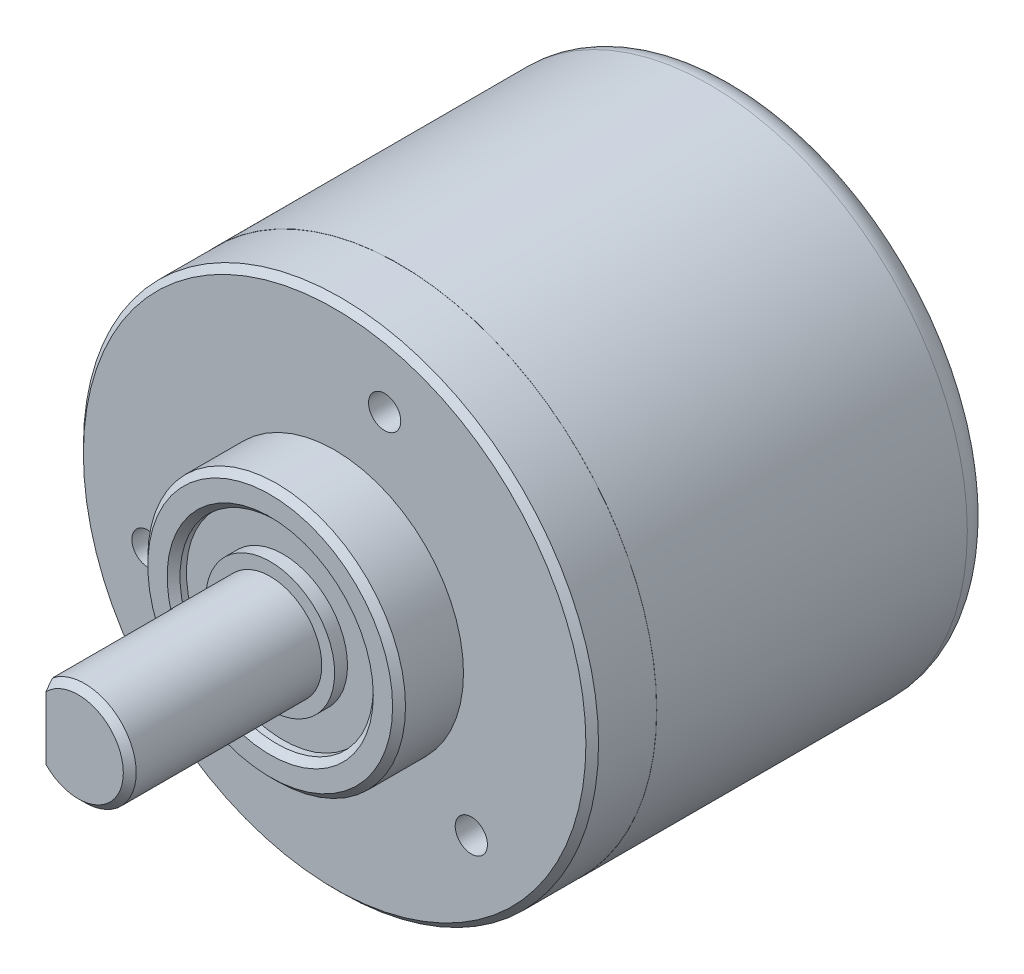
ISO-10303-21;
HEADER;
FILE_DESCRIPTION(('STEP AP214'),'2;1');
FILE_NAME('part.step','',(''),(''),'','','');
FILE_SCHEMA(('AUTOMOTIVE_DESIGN { 1 0 10303 214 1 1 1 1 }'));
ENDSEC;
DATA;
#1=APPLICATION_CONTEXT('core data for automotive mechanical design processes');
#2=APPLICATION_PROTOCOL_DEFINITION('international standard','automotive_design',2000,#1);
#3=PRODUCT_CONTEXT('',#1,'mechanical');
#4=PRODUCT('Part','Part','',(#3));
#5=PRODUCT_RELATED_PRODUCT_CATEGORY('part','',(#4));
#6=PRODUCT_DEFINITION_FORMATION('','',#4);
#7=PRODUCT_DEFINITION_CONTEXT('part definition',#1,'design');
#8=PRODUCT_DEFINITION('design','',#6,#7);
#9=PRODUCT_DEFINITION_SHAPE('','',#8);
#10=(LENGTH_UNIT() NAMED_UNIT(*) SI_UNIT(.MILLI.,.METRE.));
#11=(NAMED_UNIT(*) PLANE_ANGLE_UNIT() SI_UNIT($,.RADIAN.));
#12=(NAMED_UNIT(*) SI_UNIT($,.STERADIAN.) SOLID_ANGLE_UNIT());
#13=UNCERTAINTY_MEASURE_WITH_UNIT(LENGTH_MEASURE(1.E-05),#10,'distance_accuracy_value','');
#14=(GEOMETRIC_REPRESENTATION_CONTEXT(3) GLOBAL_UNCERTAINTY_ASSIGNED_CONTEXT((#13)) GLOBAL_UNIT_ASSIGNED_CONTEXT((#10,
#11,#12)) REPRESENTATION_CONTEXT('',''));
#15=CARTESIAN_POINT('',(0.,0.,0.));
#16=DIRECTION('',(0.,0.,1.));
#17=DIRECTION('',(1.,0.,0.));
#18=AXIS2_PLACEMENT_3D('',#15,#16,#17);
#19=CARTESIAN_POINT('',(0.,0.,-19.9));
#20=DIRECTION('',(0.,0.,-1.));
#21=DIRECTION('',(-1.,0.,0.));
#22=AXIS2_PLACEMENT_3D('',#19,#20,#21);
#23=CONICAL_SURFACE('',#22,19.5,0.785398163397438);
#24=CARTESIAN_POINT('',(0.,0.,-19.9));
#25=DIRECTION('',(0.,0.,1.));
#26=DIRECTION('',(1.,0.,0.));
#27=AXIS2_PLACEMENT_3D('',#24,#25,#26);
#28=CIRCLE('',#27,19.5);
#29=CARTESIAN_POINT('',(19.5,0.,-19.9));
#30=VERTEX_POINT('',#29);
#31=EDGE_CURVE('E11',#30,#30,#28,.T.);
#32=ORIENTED_EDGE('',*,*,#31,.F.);
#33=EDGE_LOOP('',(#32));
#34=FACE_BOUND('',#33,.T.);
#35=CARTESIAN_POINT('',(0.,0.,-20.39));
#36=DIRECTION('',(0.,0.,-1.));
#37=DIRECTION('',(-1.,0.,0.));
#38=AXIS2_PLACEMENT_3D('',#35,#36,#37);
#39=CIRCLE('',#38,19.99);
#40=CARTESIAN_POINT('',(-19.99,0.,-20.39));
#41=VERTEX_POINT('',#40);
#42=EDGE_CURVE('E42',#41,#41,#39,.F.);
#43=ORIENTED_EDGE('',*,*,#42,.T.);
#44=EDGE_LOOP('',(#43));
#45=FACE_BOUND('',#44,.T.);
#46=ADVANCED_FACE('F39',(#34,#45),#23,.T.);
#47=CARTESIAN_POINT('',(0.,0.,0.));
#48=DIRECTION('',(0.,0.,1.));
#49=DIRECTION('',(1.,0.,0.));
#50=AXIS2_PLACEMENT_3D('',#47,#48,#49);
#51=PLANE('',#50);
#52=DIRECTION('',(0.,1.,0.));
#53=VECTOR('',#52,1.);
#54=CARTESIAN_POINT('',(-2.5,3.1224989991992,0.));
#55=LINE('',#54,#53);
#56=CARTESIAN_POINT('',(-2.5,-2.44948974278318,0.));
#57=VERTEX_POINT('',#56);
#58=CARTESIAN_POINT('',(-2.5,2.44948974278318,0.));
#59=VERTEX_POINT('',#58);
#60=EDGE_CURVE('E114',#57,#59,#55,.T.);
#61=ORIENTED_EDGE('',*,*,#60,.F.);
#62=CARTESIAN_POINT('',(0.,0.,0.));
#63=DIRECTION('',(0.,0.,1.));
#64=DIRECTION('',(1.,0.,0.));
#65=AXIS2_PLACEMENT_3D('',#62,#63,#64);
#66=CIRCLE('',#65,3.5);
#67=EDGE_CURVE('E154',#57,#59,#66,.T.);
#68=ORIENTED_EDGE('',*,*,#67,.T.);
#69=EDGE_LOOP('',(#61,#68));
#70=FACE_BOUND('',#69,.T.);
#71=ADVANCED_FACE('F220',(#70),#51,.T.);
#72=CARTESIAN_POINT('',(0.,0.,0.));
#73=DIRECTION('',(0.,0.,1.));
#74=DIRECTION('',(1.,0.,0.));
#75=AXIS2_PLACEMENT_3D('',#72,#73,#74);
#76=CYLINDRICAL_SURFACE('',#75,4.);
#77=DIRECTION('',(0.,0.,1.));
#78=VECTOR('',#77,1.);
#79=CARTESIAN_POINT('',(-2.5,3.1224989991992,-10.));
#80=LINE('',#79,#78);
#81=CARTESIAN_POINT('',(-2.5,3.1224989991992,-10.));
#82=VERTEX_POINT('',#81);
#83=CARTESIAN_POINT('',(-2.5,3.1224989991992,-0.500000000000004));
#84=VERTEX_POINT('',#83);
#85=EDGE_CURVE('E121',#82,#84,#80,.T.);
#86=ORIENTED_EDGE('',*,*,#85,.T.);
#87=CARTESIAN_POINT('',(0.,0.,-0.500000000000003));
#88=DIRECTION('',(0.,0.,1.));
#89=DIRECTION('',(1.,0.,0.));
#90=AXIS2_PLACEMENT_3D('',#87,#88,#89);
#91=CIRCLE('',#90,4.);
#92=CARTESIAN_POINT('',(-2.5,-3.1224989991992,-0.500000000000004));
#93=VERTEX_POINT('',#92);
#94=EDGE_CURVE('E54',#84,#93,#91,.F.);
#95=ORIENTED_EDGE('',*,*,#94,.T.);
#96=DIRECTION('',(0.,0.,1.));
#97=VECTOR('',#96,1.);
#98=CARTESIAN_POINT('',(-2.5,-3.1224989991992,-10.));
#99=LINE('',#98,#97);
#100=CARTESIAN_POINT('',(-2.5,-3.1224989991992,-10.));
#101=VERTEX_POINT('',#100);
#102=EDGE_CURVE('E119',#101,#93,#99,.T.);
#103=ORIENTED_EDGE('',*,*,#102,.F.);
#104=CARTESIAN_POINT('',(0.,0.,-10.));
#105=DIRECTION('',(0.,0.,1.));
#106=DIRECTION('',(1.,0.,0.));
#107=AXIS2_PLACEMENT_3D('',#104,#105,#106);
#108=CIRCLE('',#107,4.);
#109=EDGE_CURVE('E115',#82,#101,#108,.T.);
#110=ORIENTED_EDGE('',*,*,#109,.F.);
#111=EDGE_LOOP('',(#86,#95,#103,#110));
#112=FACE_BOUND('',#111,.T.);
#113=CARTESIAN_POINT('',(0.,0.,-14.9));
#114=DIRECTION('',(0.,0.,1.));
#115=DIRECTION('',(1.,0.,0.));
#116=AXIS2_PLACEMENT_3D('',#113,#114,#115);
#117=CIRCLE('',#116,4.);
#118=CARTESIAN_POINT('',(4.,0.,-14.9));
#119=VERTEX_POINT('',#118);
#120=EDGE_CURVE('E136',#119,#119,#117,.T.);
#121=ORIENTED_EDGE('',*,*,#120,.T.);
#122=EDGE_LOOP('',(#121));
#123=FACE_BOUND('',#122,.T.);
#124=ADVANCED_FACE('F216',(#112,#123),#76,.T.);
#125=CARTESIAN_POINT('',(0.,-4.,-14.9));
#126=DIRECTION('',(0.,0.,1.));
#127=DIRECTION('',(1.,0.,0.));
#128=AXIS2_PLACEMENT_3D('',#125,#126,#127);
#129=PLANE('',#128);
#130=CARTESIAN_POINT('',(0.,0.,-14.9));
#131=DIRECTION('',(0.,0.,1.));
#132=DIRECTION('',(1.,0.,0.));
#133=AXIS2_PLACEMENT_3D('',#130,#131,#132);
#134=CIRCLE('',#133,5.);
#135=CARTESIAN_POINT('',(5.,0.,-14.9));
#136=VERTEX_POINT('',#135);
#137=EDGE_CURVE('E133',#136,#136,#134,.T.);
#138=ORIENTED_EDGE('',*,*,#137,.T.);
#139=EDGE_LOOP('',(#138));
#140=FACE_BOUND('',#139,.T.);
#141=ORIENTED_EDGE('',*,*,#120,.F.);
#142=EDGE_LOOP('',(#141));
#143=FACE_BOUND('',#142,.T.);
#144=ADVANCED_FACE('F212',(#140,#143),#129,.T.);
#145=CARTESIAN_POINT('',(0.,0.,0.));
#146=DIRECTION('',(0.,0.,1.));
#147=DIRECTION('',(1.,0.,0.));
#148=AXIS2_PLACEMENT_3D('',#145,#146,#147);
#149=CYLINDRICAL_SURFACE('',#148,5.);
#150=CARTESIAN_POINT('',(0.,0.,-15.9));
#151=DIRECTION('',(0.,0.,1.));
#152=DIRECTION('',(1.,0.,0.));
#153=AXIS2_PLACEMENT_3D('',#150,#151,#152);
#154=CIRCLE('',#153,5.);
#155=CARTESIAN_POINT('',(5.,0.,-15.9));
#156=VERTEX_POINT('',#155);
#157=EDGE_CURVE('E130',#156,#156,#154,.T.);
#158=ORIENTED_EDGE('',*,*,#157,.T.);
#159=EDGE_LOOP('',(#158));
#160=FACE_BOUND('',#159,.T.);
#161=ORIENTED_EDGE('',*,*,#137,.F.);
#162=EDGE_LOOP('',(#161));
#163=FACE_BOUND('',#162,.T.);
#164=ADVANCED_FACE('F208',(#160,#163),#149,.T.);
#165=CARTESIAN_POINT('',(0.,-5.,-15.9));
#166=DIRECTION('',(0.,0.,1.));
#167=DIRECTION('',(1.,0.,0.));
#168=AXIS2_PLACEMENT_3D('',#165,#166,#167);
#169=PLANE('',#168);
#170=CARTESIAN_POINT('',(0.,0.,-15.9));
#171=DIRECTION('',(0.,0.,1.));
#172=DIRECTION('',(1.,0.,0.));
#173=AXIS2_PLACEMENT_3D('',#170,#171,#172);
#174=CIRCLE('',#173,7.5);
#175=CARTESIAN_POINT('',(7.5,0.,-15.9));
#176=VERTEX_POINT('',#175);
#177=EDGE_CURVE('E127',#176,#176,#174,.T.);
#178=ORIENTED_EDGE('',*,*,#177,.T.);
#179=EDGE_LOOP('',(#178));
#180=FACE_BOUND('',#179,.T.);
#181=ORIENTED_EDGE('',*,*,#157,.F.);
#182=EDGE_LOOP('',(#181));
#183=FACE_BOUND('',#182,.T.);
#184=ADVANCED_FACE('F204',(#180,#183),#169,.T.);
#185=CARTESIAN_POINT('',(0.,0.,0.));
#186=DIRECTION('',(0.,0.,1.));
#187=DIRECTION('',(1.,0.,0.));
#188=AXIS2_PLACEMENT_3D('',#185,#186,#187);
#189=CYLINDRICAL_SURFACE('',#188,7.5);
#190=CARTESIAN_POINT('',(0.,0.,-15.4));
#191=DIRECTION('',(0.,0.,1.));
#192=DIRECTION('',(1.,0.,0.));
#193=AXIS2_PLACEMENT_3D('',#190,#191,#192);
#194=CIRCLE('',#193,7.5);
#195=CARTESIAN_POINT('',(7.5,0.,-15.4));
#196=VERTEX_POINT('',#195);
#197=EDGE_CURVE('E145',#196,#196,#194,.T.);
#198=ORIENTED_EDGE('',*,*,#197,.T.);
#199=EDGE_LOOP('',(#198));
#200=FACE_BOUND('',#199,.T.);
#201=ORIENTED_EDGE('',*,*,#177,.F.);
#202=EDGE_LOOP('',(#201));
#203=FACE_BOUND('',#202,.T.);
#204=ADVANCED_FACE('F200',(#200,#203),#189,.F.);
#205=CARTESIAN_POINT('',(0.,-7.5,-14.9));
#206=DIRECTION('',(0.,0.,1.));
#207=DIRECTION('',(1.,0.,0.));
#208=AXIS2_PLACEMENT_3D('',#205,#206,#207);
#209=PLANE('',#208);
#210=CARTESIAN_POINT('',(0.,0.,-14.9));
#211=DIRECTION('',(0.,0.,1.));
#212=DIRECTION('',(1.,0.,0.));
#213=AXIS2_PLACEMENT_3D('',#210,#211,#212);
#214=CIRCLE('',#213,7.99999999999999);
#215=CARTESIAN_POINT('',(7.99999999999999,0.,-14.9));
#216=VERTEX_POINT('',#215);
#217=EDGE_CURVE('E151',#216,#216,#214,.F.);
#218=ORIENTED_EDGE('',*,*,#217,.T.);
#219=EDGE_LOOP('',(#218));
#220=FACE_BOUND('',#219,.T.);
#221=CARTESIAN_POINT('',(0.,0.,-14.9));
#222=DIRECTION('',(0.,0.,1.));
#223=DIRECTION('',(1.,0.,0.));
#224=AXIS2_PLACEMENT_3D('',#221,#222,#223);
#225=CIRCLE('',#224,9.50000000000001);
#226=CARTESIAN_POINT('',(9.50000000000001,0.,-14.9));
#227=VERTEX_POINT('',#226);
#228=EDGE_CURVE('E148',#227,#227,#225,.T.);
#229=ORIENTED_EDGE('',*,*,#228,.T.);
#230=EDGE_LOOP('',(#229));
#231=FACE_BOUND('',#230,.T.);
#232=ADVANCED_FACE('F196',(#220,#231),#209,.T.);
#233=CARTESIAN_POINT('',(0.,0.,0.));
#234=DIRECTION('',(0.,0.,1.));
#235=DIRECTION('',(1.,0.,0.));
#236=AXIS2_PLACEMENT_3D('',#233,#234,#235);
#237=CYLINDRICAL_SURFACE('',#236,10.);
#238=CARTESIAN_POINT('',(0.,0.,-15.4));
#239=DIRECTION('',(0.,0.,1.));
#240=DIRECTION('',(1.,0.,0.));
#241=AXIS2_PLACEMENT_3D('',#238,#239,#240);
#242=CIRCLE('',#241,10.);
#243=CARTESIAN_POINT('',(10.,0.,-15.4));
#244=VERTEX_POINT('',#243);
#245=EDGE_CURVE('E47',#244,#244,#242,.F.);
#246=ORIENTED_EDGE('',*,*,#245,.T.);
#247=EDGE_LOOP('',(#246));
#248=FACE_BOUND('',#247,.T.);
#249=CARTESIAN_POINT('',(0.,0.,-19.9));
#250=DIRECTION('',(0.,0.,1.));
#251=DIRECTION('',(1.,0.,0.));
#252=AXIS2_PLACEMENT_3D('',#249,#250,#251);
#253=CIRCLE('',#252,10.);
#254=CARTESIAN_POINT('',(10.,0.,-19.9));
#255=VERTEX_POINT('',#254);
#256=EDGE_CURVE('E123',#255,#255,#253,.T.);
#257=ORIENTED_EDGE('',*,*,#256,.T.);
#258=EDGE_LOOP('',(#257));
#259=FACE_BOUND('',#258,.T.);
#260=ADVANCED_FACE('F192',(#248,#259),#237,.T.);
#261=CARTESIAN_POINT('',(0.,-10.,-19.9));
#262=DIRECTION('',(0.,0.,1.));
#263=DIRECTION('',(1.,0.,0.));
#264=AXIS2_PLACEMENT_3D('',#261,#262,#263);
#265=PLANE('',#264);
#266=CARTESIAN_POINT('',(3.88228567653791,14.488887394336,-19.9));
#267=DIRECTION('',(0.,0.,1.));
#268=DIRECTION('',(1.,0.,0.));
#269=AXIS2_PLACEMENT_3D('',#266,#267,#268);
#270=CIRCLE('',#269,1.24999999999999);
#271=CARTESIAN_POINT('',(5.1322856765379,14.488887394336,-19.9));
#272=VERTEX_POINT('',#271);
#273=EDGE_CURVE('E93',#272,#272,#270,.T.);
#274=ORIENTED_EDGE('',*,*,#273,.F.);
#275=EDGE_LOOP('',(#274));
#276=FACE_BOUND('',#275,.T.);
#277=CARTESIAN_POINT('',(-14.488887394336,-3.88228567653778,-19.9));
#278=DIRECTION('',(0.,0.,1.));
#279=DIRECTION('',(1.,0.,0.));
#280=AXIS2_PLACEMENT_3D('',#277,#278,#279);
#281=CIRCLE('',#280,1.24999999999999);
#282=CARTESIAN_POINT('',(-13.238887394336,-3.88228567653778,-19.9));
#283=VERTEX_POINT('',#282);
#284=EDGE_CURVE('E105',#283,#283,#281,.T.);
#285=ORIENTED_EDGE('',*,*,#284,.F.);
#286=EDGE_LOOP('',(#285));
#287=FACE_BOUND('',#286,.T.);
#288=CARTESIAN_POINT('',(10.6066017177982,-10.6066017177982,-19.9));
#289=DIRECTION('',(0.,0.,1.));
#290=DIRECTION('',(1.,0.,0.));
#291=AXIS2_PLACEMENT_3D('',#288,#289,#290);
#292=CIRCLE('',#291,1.24999999999999);
#293=CARTESIAN_POINT('',(11.8566017177982,-10.6066017177982,-19.9));
#294=VERTEX_POINT('',#293);
#295=EDGE_CURVE('E111',#294,#294,#292,.T.);
#296=ORIENTED_EDGE('',*,*,#295,.F.);
#297=EDGE_LOOP('',(#296));
#298=FACE_BOUND('',#297,.T.);
#299=ORIENTED_EDGE('',*,*,#31,.T.);
#300=EDGE_LOOP('',(#299));
#301=FACE_BOUND('',#300,.T.);
#302=ORIENTED_EDGE('',*,*,#256,.F.);
#303=EDGE_LOOP('',(#302));
#304=FACE_BOUND('',#303,.T.);
#305=ADVANCED_FACE('F177',(#276,#287,#298,#301,#304),#265,.T.);
#306=CARTESIAN_POINT('',(-2.5,3.1224989991992,-10.));
#307=DIRECTION('',(1.,0.,0.));
#308=DIRECTION('',(0.,0.,-1.));
#309=AXIS2_PLACEMENT_3D('',#306,#307,#308);
#310=PLANE('',#309);
#311=ORIENTED_EDGE('',*,*,#60,.T.);
#312=CARTESIAN_POINT('',(-2.5,2.44948974278318,0.));
#313=CARTESIAN_POINT('',(-2.5,2.50674279644306,-0.0400736168105133));
#314=CARTESIAN_POINT('',(-2.5,2.56366194472915,-0.0806205687929539));
#315=CARTESIAN_POINT('',(-2.5,2.67688892976408,-0.162539891199233));
#316=CARTESIAN_POINT('',(-2.5,2.73319686781497,-0.203912121513368));
#317=CARTESIAN_POINT('',(-2.5,2.84527530245129,-0.287372932091278));
#318=CARTESIAN_POINT('',(-2.5,2.90104581683119,-0.329461488508483));
#319=CARTESIAN_POINT('',(-2.5,3.01211507625871,-0.414276093062564));
#320=CARTESIAN_POINT('',(-2.5,3.0674137403718,-0.457002247241331));
#321=CARTESIAN_POINT('',(-2.5,3.1224989991992,-0.500000000000003));
#322=B_SPLINE_CURVE_WITH_KNOTS('',3,(#312,#313,#314,#315,#316,#317,#318,#319,#320,#321),
.UNSPECIFIED.,.F.,.F.,(4,2,2,2,4),(0.,0.209647256425445,0.419259218400469,0.628864215967589,
0.838504471288743),.UNSPECIFIED.);
#323=EDGE_CURVE('E62',#59,#84,#322,.T.);
#324=ORIENTED_EDGE('',*,*,#323,.T.);
#325=ORIENTED_EDGE('',*,*,#85,.F.);
#326=DIRECTION('',(0.,1.,0.));
#327=VECTOR('',#326,1.);
#328=CARTESIAN_POINT('',(-2.5,3.1224989991992,-10.));
#329=LINE('',#328,#327);
#330=EDGE_CURVE('E117',#101,#82,#329,.T.);
#331=ORIENTED_EDGE('',*,*,#330,.F.);
#332=ORIENTED_EDGE('',*,*,#102,.T.);
#333=CARTESIAN_POINT('',(-2.5,-3.1224989991992,-0.500000000000003));
#334=CARTESIAN_POINT('',(-2.5,-3.0674137403718,-0.457002247241331));
#335=CARTESIAN_POINT('',(-2.5,-3.01211507625871,-0.414276093062564));
#336=CARTESIAN_POINT('',(-2.5,-2.90104581683119,-0.329461488508483));
#337=CARTESIAN_POINT('',(-2.5,-2.84527530245129,-0.287372932091278));
#338=CARTESIAN_POINT('',(-2.5,-2.73319686781497,-0.203912121513367));
#339=CARTESIAN_POINT('',(-2.5,-2.67688892976408,-0.162539891199233));
#340=CARTESIAN_POINT('',(-2.5,-2.56366194472915,-0.0806205687929536));
#341=CARTESIAN_POINT('',(-2.5,-2.50674279644306,-0.0400736168105131));
#342=CARTESIAN_POINT('',(-2.5,-2.44948974278318,0.));
#343=B_SPLINE_CURVE_WITH_KNOTS('',3,(#333,#334,#335,#336,#337,#338,#339,#340,#341,#342),
.UNSPECIFIED.,.F.,.F.,(4,2,2,2,4),(0.,0.209640255321153,0.419245252888274,0.628857214863298,
0.838504471288743),.UNSPECIFIED.);
#344=EDGE_CURVE('E157',#93,#57,#343,.T.);
#345=ORIENTED_EDGE('',*,*,#344,.T.);
#346=EDGE_LOOP('',(#311,#324,#325,#331,#332,#345));
#347=FACE_BOUND('',#346,.T.);
#348=ADVANCED_FACE('F171',(#347),#310,.F.);
#349=CARTESIAN_POINT('',(0.,0.,-10.));
#350=DIRECTION('',(0.,0.,1.));
#351=DIRECTION('',(1.,0.,0.));
#352=AXIS2_PLACEMENT_3D('',#349,#350,#351);
#353=PLANE('',#352);
#354=ORIENTED_EDGE('',*,*,#109,.T.);
#355=ORIENTED_EDGE('',*,*,#330,.T.);
#356=EDGE_LOOP('',(#354,#355));
#357=FACE_BOUND('',#356,.T.);
#358=ADVANCED_FACE('F176',(#357),#353,.T.);
#359=CARTESIAN_POINT('',(0.,0.,-15.4));
#360=DIRECTION('',(0.,0.,1.));
#361=DIRECTION('',(1.,0.,0.));
#362=AXIS2_PLACEMENT_3D('',#359,#360,#361);
#363=CONICAL_SURFACE('',#362,7.5,0.785398163397452);
#364=ORIENTED_EDGE('',*,*,#217,.F.);
#365=EDGE_LOOP('',(#364));
#366=FACE_BOUND('',#365,.T.);
#367=ORIENTED_EDGE('',*,*,#197,.F.);
#368=EDGE_LOOP('',(#367));
#369=FACE_BOUND('',#368,.T.);
#370=ADVANCED_FACE('F226',(#366,#369),#363,.F.);
#371=CARTESIAN_POINT('',(0.,0.,0.));
#372=DIRECTION('',(0.,0.,-1.));
#373=DIRECTION('',(-1.,0.,0.));
#374=AXIS2_PLACEMENT_3D('',#371,#372,#373);
#375=CONICAL_SURFACE('',#374,3.5,0.785398163397442);
#376=ORIENTED_EDGE('',*,*,#344,.F.);
#377=ORIENTED_EDGE('',*,*,#94,.F.);
#378=ORIENTED_EDGE('',*,*,#323,.F.);
#379=ORIENTED_EDGE('',*,*,#67,.F.);
#380=EDGE_LOOP('',(#376,#377,#378,#379));
#381=FACE_BOUND('',#380,.T.);
#382=ADVANCED_FACE('F168',(#381),#375,.T.);
#383=CARTESIAN_POINT('',(0.,0.,-14.9));
#384=DIRECTION('',(0.,0.,-1.));
#385=DIRECTION('',(-1.,0.,0.));
#386=AXIS2_PLACEMENT_3D('',#383,#384,#385);
#387=CONICAL_SURFACE('',#386,9.50000000000001,0.785398163397443);
#388=ORIENTED_EDGE('',*,*,#245,.F.);
#389=EDGE_LOOP('',(#388));
#390=FACE_BOUND('',#389,.T.);
#391=ORIENTED_EDGE('',*,*,#228,.F.);
#392=EDGE_LOOP('',(#391));
#393=FACE_BOUND('',#392,.T.);
#394=ADVANCED_FACE('F233',(#390,#393),#387,.T.);
#395=CARTESIAN_POINT('',(10.6066017177982,-10.6066017177982,-19.9));
#396=DIRECTION('',(0.,0.,1.));
#397=DIRECTION('',(1.,0.,0.));
#398=AXIS2_PLACEMENT_3D('',#395,#396,#397);
#399=CYLINDRICAL_SURFACE('',#398,1.24999999999999);
#400=CARTESIAN_POINT('',(10.6066017177982,-10.6066017177982,-28.4));
#401=DIRECTION('',(0.,0.,1.));
#402=DIRECTION('',(1.,0.,0.));
#403=AXIS2_PLACEMENT_3D('',#400,#401,#402);
#404=CIRCLE('',#403,1.24999999999999);
#405=CARTESIAN_POINT('',(11.8566017177982,-10.6066017177982,-28.4));
#406=VERTEX_POINT('',#405);
#407=EDGE_CURVE('E108',#406,#406,#404,.T.);
#408=ORIENTED_EDGE('',*,*,#407,.F.);
#409=EDGE_LOOP('',(#408));
#410=FACE_BOUND('',#409,.T.);
#411=ORIENTED_EDGE('',*,*,#295,.T.);
#412=EDGE_LOOP('',(#411));
#413=FACE_BOUND('',#412,.T.);
#414=ADVANCED_FACE('F274',(#410,#413),#399,.F.);
#415=CARTESIAN_POINT('',(10.6066017177982,-10.6066017177982,-28.4));
#416=DIRECTION('',(0.,0.,1.));
#417=DIRECTION('',(1.,0.,0.));
#418=AXIS2_PLACEMENT_3D('',#415,#416,#417);
#419=CONICAL_SURFACE('',#418,1.24999999999999,1.02974425867665);
#420=CARTESIAN_POINT('',(10.6066017177982,-10.6066017177982,-29.1510757737845));
#421=VERTEX_POINT('',#420);
#422=VERTEX_LOOP('',#421);
#423=FACE_BOUND('',#422,.T.);
#424=ORIENTED_EDGE('',*,*,#407,.T.);
#425=EDGE_LOOP('',(#424));
#426=FACE_BOUND('',#425,.T.);
#427=ADVANCED_FACE('F271',(#423,#426),#419,.F.);
#428=CARTESIAN_POINT('',(-14.488887394336,-3.88228567653778,-19.9));
#429=DIRECTION('',(0.,0.,1.));
#430=DIRECTION('',(1.,0.,0.));
#431=AXIS2_PLACEMENT_3D('',#428,#429,#430);
#432=CYLINDRICAL_SURFACE('',#431,1.24999999999999);
#433=CARTESIAN_POINT('',(-14.488887394336,-3.88228567653778,-28.4));
#434=DIRECTION('',(0.,0.,1.));
#435=DIRECTION('',(1.,0.,0.));
#436=AXIS2_PLACEMENT_3D('',#433,#434,#435);
#437=CIRCLE('',#436,1.24999999999999);
#438=CARTESIAN_POINT('',(-13.238887394336,-3.88228567653778,-28.4));
#439=VERTEX_POINT('',#438);
#440=EDGE_CURVE('E96',#439,#439,#437,.T.);
#441=ORIENTED_EDGE('',*,*,#440,.F.);
#442=EDGE_LOOP('',(#441));
#443=FACE_BOUND('',#442,.T.);
#444=ORIENTED_EDGE('',*,*,#284,.T.);
#445=EDGE_LOOP('',(#444));
#446=FACE_BOUND('',#445,.T.);
#447=ADVANCED_FACE('F267',(#443,#446),#432,.F.);
#448=CARTESIAN_POINT('',(-14.488887394336,-3.88228567653778,-28.4));
#449=DIRECTION('',(0.,0.,1.));
#450=DIRECTION('',(1.,0.,0.));
#451=AXIS2_PLACEMENT_3D('',#448,#449,#450);
#452=CONICAL_SURFACE('',#451,1.24999999999999,1.02974425867665);
#453=CARTESIAN_POINT('',(-14.488887394336,-3.88228567653778,-29.1510757737845));
#454=VERTEX_POINT('',#453);
#455=VERTEX_LOOP('',#454);
#456=FACE_BOUND('',#455,.T.);
#457=ORIENTED_EDGE('',*,*,#440,.T.);
#458=EDGE_LOOP('',(#457));
#459=FACE_BOUND('',#458,.T.);
#460=ADVANCED_FACE('F264',(#456,#459),#452,.F.);
#461=CARTESIAN_POINT('',(3.88228567653791,14.488887394336,-19.9));
#462=DIRECTION('',(0.,0.,1.));
#463=DIRECTION('',(1.,0.,0.));
#464=AXIS2_PLACEMENT_3D('',#461,#462,#463);
#465=CYLINDRICAL_SURFACE('',#464,1.24999999999999);
#466=CARTESIAN_POINT('',(3.88228567653791,14.488887394336,-28.4));
#467=DIRECTION('',(0.,0.,1.));
#468=DIRECTION('',(1.,0.,0.));
#469=AXIS2_PLACEMENT_3D('',#466,#467,#468);
#470=CIRCLE('',#469,1.24999999999999);
#471=CARTESIAN_POINT('',(5.1322856765379,14.488887394336,-28.4));
#472=VERTEX_POINT('',#471);
#473=EDGE_CURVE('E91',#472,#472,#470,.T.);
#474=ORIENTED_EDGE('',*,*,#473,.F.);
#475=EDGE_LOOP('',(#474));
#476=FACE_BOUND('',#475,.T.);
#477=ORIENTED_EDGE('',*,*,#273,.T.);
#478=EDGE_LOOP('',(#477));
#479=FACE_BOUND('',#478,.T.);
#480=ADVANCED_FACE('F87',(#476,#479),#465,.F.);
#481=CARTESIAN_POINT('',(3.88228567653791,14.488887394336,-28.4));
#482=DIRECTION('',(0.,0.,1.));
#483=DIRECTION('',(1.,0.,0.));
#484=AXIS2_PLACEMENT_3D('',#481,#482,#483);
#485=CONICAL_SURFACE('',#484,1.24999999999999,1.02974425867665);
#486=CARTESIAN_POINT('',(3.88228567653791,14.488887394336,-29.1510757737845));
#487=VERTEX_POINT('',#486);
#488=VERTEX_LOOP('',#487);
#489=FACE_BOUND('',#488,.T.);
#490=ORIENTED_EDGE('',*,*,#473,.T.);
#491=EDGE_LOOP('',(#490));
#492=FACE_BOUND('',#491,.T.);
#493=ADVANCED_FACE('F83',(#489,#492),#485,.F.);
#494=CARTESIAN_POINT('',(0.,0.,-24.9));
#495=DIRECTION('',(0.,0.,1.));
#496=DIRECTION('',(1.,0.,0.));
#497=AXIS2_PLACEMENT_3D('',#494,#495,#496);
#498=PLANE('',#497);
#499=CARTESIAN_POINT('',(0.,0.,-24.9));
#500=DIRECTION('',(0.,0.,1.));
#501=DIRECTION('',(1.,0.,0.));
#502=AXIS2_PLACEMENT_3D('',#499,#500,#501);
#503=CIRCLE('',#502,19.99);
#504=CARTESIAN_POINT('',(19.99,0.,-24.9));
#505=VERTEX_POINT('',#504);
#506=EDGE_CURVE('E251',#505,#505,#503,.T.);
#507=ORIENTED_EDGE('',*,*,#506,.F.);
#508=EDGE_LOOP('',(#507));
#509=FACE_BOUND('',#508,.T.);
#510=CARTESIAN_POINT('',(0.,0.,-24.9));
#511=DIRECTION('',(0.,0.,1.));
#512=DIRECTION('',(1.,0.,0.));
#513=AXIS2_PLACEMENT_3D('',#510,#511,#512);
#514=CIRCLE('',#513,20.);
#515=CARTESIAN_POINT('',(20.,0.,-24.9));
#516=VERTEX_POINT('',#515);
#517=EDGE_CURVE('E99',#516,#516,#514,.T.);
#518=ORIENTED_EDGE('',*,*,#517,.T.);
#519=EDGE_LOOP('',(#518));
#520=FACE_BOUND('',#519,.T.);
#521=ADVANCED_FACE('F86',(#509,#520),#498,.T.);
#522=CARTESIAN_POINT('',(0.,0.,-24.9));
#523=DIRECTION('',(0.,0.,1.));
#524=DIRECTION('',(1.,0.,0.));
#525=AXIS2_PLACEMENT_3D('',#522,#523,#524);
#526=CYLINDRICAL_SURFACE('',#525,19.99);
#527=ORIENTED_EDGE('',*,*,#42,.F.);
#528=EDGE_LOOP('',(#527));
#529=FACE_BOUND('',#528,.T.);
#530=ORIENTED_EDGE('',*,*,#506,.T.);
#531=EDGE_LOOP('',(#530));
#532=FACE_BOUND('',#531,.T.);
#533=ADVANCED_FACE('F184',(#529,#532),#526,.T.);
#534=CARTESIAN_POINT('',(0.,-20.,-51.));
#535=DIRECTION('',(0.,0.,-1.));
#536=DIRECTION('',(-1.,0.,0.));
#537=AXIS2_PLACEMENT_3D('',#534,#535,#536);
#538=PLANE('',#537);
#539=CARTESIAN_POINT('',(0.,0.,-51.));
#540=DIRECTION('',(0.,0.,-1.));
#541=DIRECTION('',(-1.,0.,0.));
#542=AXIS2_PLACEMENT_3D('',#539,#540,#541);
#543=CIRCLE('',#542,18.);
#544=CARTESIAN_POINT('',(-18.,0.,-51.));
#545=VERTEX_POINT('',#544);
#546=EDGE_CURVE('E142',#545,#545,#543,.T.);
#547=ORIENTED_EDGE('',*,*,#546,.T.);
#548=EDGE_LOOP('',(#547));
#549=FACE_BOUND('',#548,.T.);
#550=ADVANCED_FACE('F179',(#549),#538,.T.);
#551=CARTESIAN_POINT('',(0.,0.,-49.));
#552=DIRECTION('',(0.,0.,-1.));
#553=DIRECTION('',(-1.,0.,0.));
#554=AXIS2_PLACEMENT_3D('',#551,#552,#553);
#555=TOROIDAL_SURFACE('',#554,18.,2.);
#556=ORIENTED_EDGE('',*,*,#546,.F.);
#557=EDGE_LOOP('',(#556));
#558=FACE_BOUND('',#557,.T.);
#559=CARTESIAN_POINT('',(0.,0.,-49.));
#560=DIRECTION('',(0.,0.,-1.));
#561=DIRECTION('',(-1.,0.,0.));
#562=AXIS2_PLACEMENT_3D('',#559,#560,#561);
#563=CIRCLE('',#562,20.);
#564=CARTESIAN_POINT('',(-20.,0.,-49.));
#565=VERTEX_POINT('',#564);
#566=EDGE_CURVE('E139',#565,#565,#563,.F.);
#567=ORIENTED_EDGE('',*,*,#566,.F.);
#568=EDGE_LOOP('',(#567));
#569=FACE_BOUND('',#568,.T.);
#570=ADVANCED_FACE('F183',(#558,#569),#555,.T.);
#571=CARTESIAN_POINT('',(0.,0.,0.));
#572=DIRECTION('',(0.,0.,1.));
#573=DIRECTION('',(1.,0.,0.));
#574=AXIS2_PLACEMENT_3D('',#571,#572,#573);
#575=CYLINDRICAL_SURFACE('',#574,20.);
#576=ORIENTED_EDGE('',*,*,#566,.T.);
#577=EDGE_LOOP('',(#576));
#578=FACE_BOUND('',#577,.T.);
#579=ORIENTED_EDGE('',*,*,#517,.F.);
#580=EDGE_LOOP('',(#579));
#581=FACE_BOUND('',#580,.T.);
#582=ADVANCED_FACE('F186',(#578,#581),#575,.T.);
#583=CLOSED_SHELL('',(#46,#71,#124,#144,#164,#184,#204,#232,#260,#305,#348,#358,#370,#382,#394,
#414,#427,#447,#460,#480,#493,#521,#533,#550,#570,#582));
#584=MANIFOLD_SOLID_BREP('B2',#583);
#585=ADVANCED_BREP_SHAPE_REPRESENTATION('',(#18,#584),#14);
#586=SHAPE_DEFINITION_REPRESENTATION(#9,#585);
ENDSEC;
END-ISO-10303-21;
